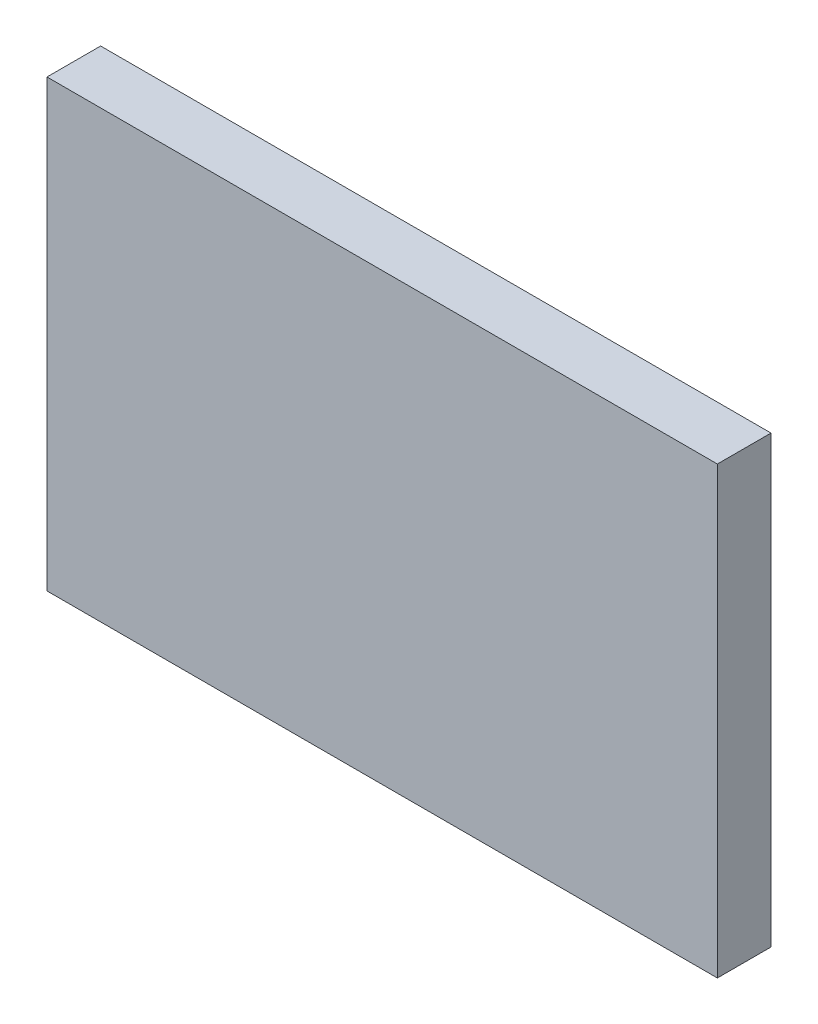
ISO-10303-21;
HEADER;
FILE_DESCRIPTION(('STEP AP214'),'2;1');
FILE_NAME('part.step','',(''),(''),'','','');
FILE_SCHEMA(('AUTOMOTIVE_DESIGN { 1 0 10303 214 1 1 1 1 }'));
ENDSEC;
DATA;
#1=APPLICATION_CONTEXT('core data for automotive mechanical design processes');
#2=APPLICATION_PROTOCOL_DEFINITION('international standard','automotive_design',2000,#1);
#3=PRODUCT_CONTEXT('',#1,'mechanical');
#4=PRODUCT('Part','Part','',(#3));
#5=PRODUCT_RELATED_PRODUCT_CATEGORY('part','',(#4));
#6=PRODUCT_DEFINITION_FORMATION('','',#4);
#7=PRODUCT_DEFINITION_CONTEXT('part definition',#1,'design');
#8=PRODUCT_DEFINITION('design','',#6,#7);
#9=PRODUCT_DEFINITION_SHAPE('','',#8);
#10=(LENGTH_UNIT() NAMED_UNIT(*) SI_UNIT(.MILLI.,.METRE.));
#11=(NAMED_UNIT(*) PLANE_ANGLE_UNIT() SI_UNIT($,.RADIAN.));
#12=(NAMED_UNIT(*) SI_UNIT($,.STERADIAN.) SOLID_ANGLE_UNIT());
#13=UNCERTAINTY_MEASURE_WITH_UNIT(LENGTH_MEASURE(1.E-05),#10,'distance_accuracy_value','');
#14=(GEOMETRIC_REPRESENTATION_CONTEXT(3) GLOBAL_UNCERTAINTY_ASSIGNED_CONTEXT((#13)) GLOBAL_UNIT_ASSIGNED_CONTEXT((#10,
#11,#12)) REPRESENTATION_CONTEXT('',''));
#15=CARTESIAN_POINT('',(0.,0.,0.));
#16=DIRECTION('',(0.,0.,1.));
#17=DIRECTION('',(1.,0.,0.));
#18=AXIS2_PLACEMENT_3D('',#15,#16,#17);
#19=CARTESIAN_POINT('',(0.,0.,0.05));
#20=DIRECTION('',(0.,0.,-1.));
#21=DIRECTION('',(-1.,0.,0.));
#22=AXIS2_PLACEMENT_3D('',#19,#20,#21);
#23=PLANE('',#22);
#24=DIRECTION('',(0.,1.,0.));
#25=VECTOR('',#24,1.);
#26=CARTESIAN_POINT('',(0.625,0.,0.05));
#27=LINE('',#26,#25);
#28=CARTESIAN_POINT('',(0.625,0.,0.05));
#29=VERTEX_POINT('',#28);
#30=CARTESIAN_POINT('',(0.625,0.415,0.05));
#31=VERTEX_POINT('',#30);
#32=EDGE_CURVE('E55',#29,#31,#27,.T.);
#33=ORIENTED_EDGE('',*,*,#32,.T.);
#34=DIRECTION('',(1.,0.,0.));
#35=VECTOR('',#34,1.);
#36=CARTESIAN_POINT('',(0.625,0.415,0.05));
#37=LINE('',#36,#35);
#38=CARTESIAN_POINT('',(0.,0.415,0.05));
#39=VERTEX_POINT('',#38);
#40=EDGE_CURVE('E57',#31,#39,#37,.F.);
#41=ORIENTED_EDGE('',*,*,#40,.T.);
#42=DIRECTION('',(0.,1.,0.));
#43=VECTOR('',#42,1.);
#44=CARTESIAN_POINT('',(0.,0.415,0.05));
#45=LINE('',#44,#43);
#46=CARTESIAN_POINT('',(0.,0.,0.05));
#47=VERTEX_POINT('',#46);
#48=EDGE_CURVE('E20',#39,#47,#45,.F.);
#49=ORIENTED_EDGE('',*,*,#48,.T.);
#50=DIRECTION('',(1.,0.,0.));
#51=VECTOR('',#50,1.);
#52=CARTESIAN_POINT('',(0.,0.,0.05));
#53=LINE('',#52,#51);
#54=EDGE_CURVE('E80',#47,#29,#53,.T.);
#55=ORIENTED_EDGE('',*,*,#54,.T.);
#56=EDGE_LOOP('',(#33,#41,#49,#55));
#57=FACE_BOUND('',#56,.T.);
#58=ADVANCED_FACE('F17',(#57),#23,.F.);
#59=CARTESIAN_POINT('',(0.,0.415,0.));
#60=DIRECTION('',(1.,0.,0.));
#61=DIRECTION('',(0.,0.,-1.));
#62=AXIS2_PLACEMENT_3D('',#59,#60,#61);
#63=PLANE('',#62);
#64=DIRECTION('',(0.,0.,1.));
#65=VECTOR('',#64,1.);
#66=CARTESIAN_POINT('',(0.,0.,0.));
#67=LINE('',#66,#65);
#68=CARTESIAN_POINT('',(0.,0.,0.));
#69=VERTEX_POINT('',#68);
#70=EDGE_CURVE('E68',#69,#47,#67,.T.);
#71=ORIENTED_EDGE('',*,*,#70,.T.);
#72=ORIENTED_EDGE('',*,*,#48,.F.);
#73=DIRECTION('',(0.,0.,-1.));
#74=VECTOR('',#73,1.);
#75=CARTESIAN_POINT('',(0.,0.415,0.));
#76=LINE('',#75,#74);
#77=CARTESIAN_POINT('',(0.,0.415,0.));
#78=VERTEX_POINT('',#77);
#79=EDGE_CURVE('E63',#39,#78,#76,.T.);
#80=ORIENTED_EDGE('',*,*,#79,.T.);
#81=DIRECTION('',(0.,1.,0.));
#82=VECTOR('',#81,1.);
#83=CARTESIAN_POINT('',(0.,0.,0.));
#84=LINE('',#83,#82);
#85=EDGE_CURVE('E83',#69,#78,#84,.T.);
#86=ORIENTED_EDGE('',*,*,#85,.F.);
#87=EDGE_LOOP('',(#71,#72,#80,#86));
#88=FACE_BOUND('',#87,.T.);
#89=ADVANCED_FACE('F65',(#88),#63,.F.);
#90=CARTESIAN_POINT('',(0.625,0.415,0.));
#91=DIRECTION('',(0.,-1.,0.));
#92=DIRECTION('',(0.,0.,-1.));
#93=AXIS2_PLACEMENT_3D('',#90,#91,#92);
#94=PLANE('',#93);
#95=ORIENTED_EDGE('',*,*,#79,.F.);
#96=ORIENTED_EDGE('',*,*,#40,.F.);
#97=DIRECTION('',(0.,0.,1.));
#98=VECTOR('',#97,1.);
#99=CARTESIAN_POINT('',(0.625,0.415,0.));
#100=LINE('',#99,#98);
#101=CARTESIAN_POINT('',(0.625,0.415,0.));
#102=VERTEX_POINT('',#101);
#103=EDGE_CURVE('E75',#31,#102,#100,.F.);
#104=ORIENTED_EDGE('',*,*,#103,.T.);
#105=DIRECTION('',(-1.,0.,0.));
#106=VECTOR('',#105,1.);
#107=CARTESIAN_POINT('',(0.,0.415,0.));
#108=LINE('',#107,#106);
#109=EDGE_CURVE('E72',#78,#102,#108,.F.);
#110=ORIENTED_EDGE('',*,*,#109,.F.);
#111=EDGE_LOOP('',(#95,#96,#104,#110));
#112=FACE_BOUND('',#111,.T.);
#113=ADVANCED_FACE('F70',(#112),#94,.F.);
#114=CARTESIAN_POINT('',(0.625,0.,0.));
#115=DIRECTION('',(-1.,0.,0.));
#116=DIRECTION('',(0.,0.,1.));
#117=AXIS2_PLACEMENT_3D('',#114,#115,#116);
#118=PLANE('',#117);
#119=ORIENTED_EDGE('',*,*,#103,.F.);
#120=ORIENTED_EDGE('',*,*,#32,.F.);
#121=DIRECTION('',(0.,0.,1.));
#122=VECTOR('',#121,1.);
#123=CARTESIAN_POINT('',(0.625,0.,0.));
#124=LINE('',#123,#122);
#125=CARTESIAN_POINT('',(0.625,0.,0.));
#126=VERTEX_POINT('',#125);
#127=EDGE_CURVE('E35',#29,#126,#124,.F.);
#128=ORIENTED_EDGE('',*,*,#127,.T.);
#129=DIRECTION('',(0.,1.,0.));
#130=VECTOR('',#129,1.);
#131=CARTESIAN_POINT('',(0.625,0.,0.));
#132=LINE('',#131,#130);
#133=EDGE_CURVE('E26',#102,#126,#132,.F.);
#134=ORIENTED_EDGE('',*,*,#133,.F.);
#135=EDGE_LOOP('',(#119,#120,#128,#134));
#136=FACE_BOUND('',#135,.T.);
#137=ADVANCED_FACE('F89',(#136),#118,.F.);
#138=CARTESIAN_POINT('',(0.,0.,0.));
#139=DIRECTION('',(0.,1.,0.));
#140=DIRECTION('',(0.,0.,1.));
#141=AXIS2_PLACEMENT_3D('',#138,#139,#140);
#142=PLANE('',#141);
#143=ORIENTED_EDGE('',*,*,#127,.F.);
#144=ORIENTED_EDGE('',*,*,#54,.F.);
#145=ORIENTED_EDGE('',*,*,#70,.F.);
#146=DIRECTION('',(-1.,0.,0.));
#147=VECTOR('',#146,1.);
#148=CARTESIAN_POINT('',(0.,0.,0.));
#149=LINE('',#148,#147);
#150=EDGE_CURVE('E11',#126,#69,#149,.T.);
#151=ORIENTED_EDGE('',*,*,#150,.F.);
#152=EDGE_LOOP('',(#143,#144,#145,#151));
#153=FACE_BOUND('',#152,.T.);
#154=ADVANCED_FACE('F91',(#153),#142,.F.);
#155=CARTESIAN_POINT('',(0.,0.,0.));
#156=DIRECTION('',(0.,0.,-1.));
#157=DIRECTION('',(-1.,0.,0.));
#158=AXIS2_PLACEMENT_3D('',#155,#156,#157);
#159=PLANE('',#158);
#160=ORIENTED_EDGE('',*,*,#133,.T.);
#161=ORIENTED_EDGE('',*,*,#150,.T.);
#162=ORIENTED_EDGE('',*,*,#85,.T.);
#163=ORIENTED_EDGE('',*,*,#109,.T.);
#164=EDGE_LOOP('',(#160,#161,#162,#163));
#165=FACE_BOUND('',#164,.T.);
#166=ADVANCED_FACE('F88',(#165),#159,.T.);
#167=CLOSED_SHELL('',(#58,#89,#113,#137,#154,#166));
#168=MANIFOLD_SOLID_BREP('B1',#167);
#169=ADVANCED_BREP_SHAPE_REPRESENTATION('',(#18,#168),#14);
#170=SHAPE_DEFINITION_REPRESENTATION(#9,#169);
ENDSEC;
END-ISO-10303-21;
